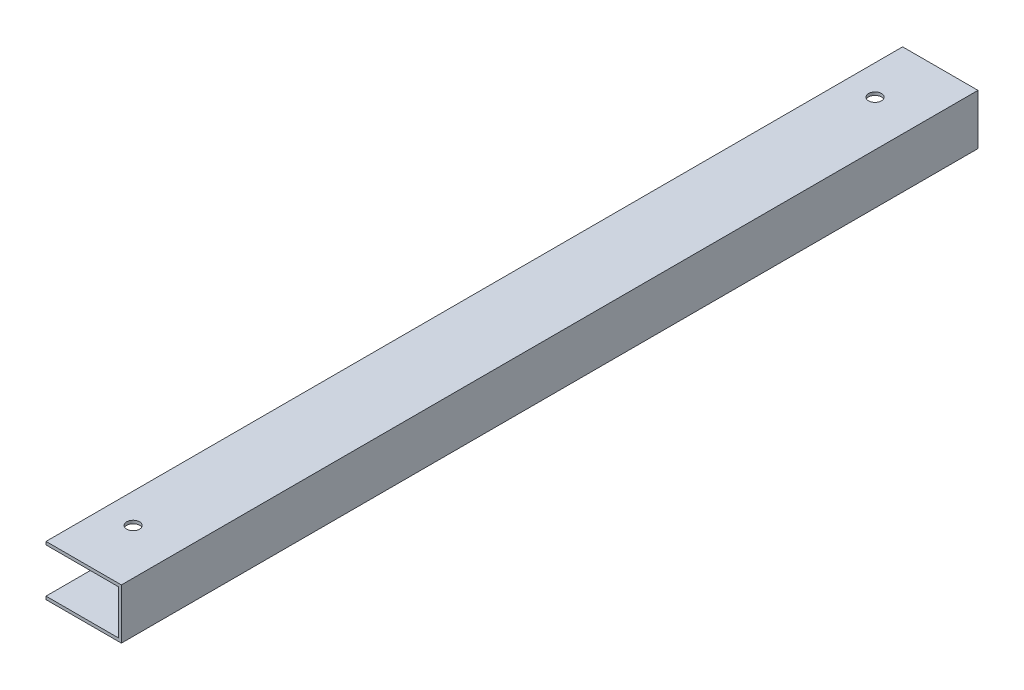
ISO-10303-21;
HEADER;
FILE_DESCRIPTION(('STEP AP214'),'2;1');
FILE_NAME('part.step','',(''),(''),'','','');
FILE_SCHEMA(('AUTOMOTIVE_DESIGN { 1 0 10303 214 1 1 1 1 }'));
ENDSEC;
DATA;
#1=APPLICATION_CONTEXT('core data for automotive mechanical design processes');
#2=APPLICATION_PROTOCOL_DEFINITION('international standard','automotive_design',2000,#1);
#3=PRODUCT_CONTEXT('',#1,'mechanical');
#4=PRODUCT('Part','Part','',(#3));
#5=PRODUCT_RELATED_PRODUCT_CATEGORY('part','',(#4));
#6=PRODUCT_DEFINITION_FORMATION('','',#4);
#7=PRODUCT_DEFINITION_CONTEXT('part definition',#1,'design');
#8=PRODUCT_DEFINITION('design','',#6,#7);
#9=PRODUCT_DEFINITION_SHAPE('','',#8);
#10=(LENGTH_UNIT() NAMED_UNIT(*) SI_UNIT(.MILLI.,.METRE.));
#11=(NAMED_UNIT(*) PLANE_ANGLE_UNIT() SI_UNIT($,.RADIAN.));
#12=(NAMED_UNIT(*) SI_UNIT($,.STERADIAN.) SOLID_ANGLE_UNIT());
#13=UNCERTAINTY_MEASURE_WITH_UNIT(LENGTH_MEASURE(1.E-05),#10,'distance_accuracy_value','');
#14=(GEOMETRIC_REPRESENTATION_CONTEXT(3) GLOBAL_UNCERTAINTY_ASSIGNED_CONTEXT((#13)) GLOBAL_UNIT_ASSIGNED_CONTEXT((#10,
#11,#12)) REPRESENTATION_CONTEXT('',''));
#15=CARTESIAN_POINT('',(0.,0.,0.));
#16=DIRECTION('',(0.,0.,1.));
#17=DIRECTION('',(1.,0.,0.));
#18=AXIS2_PLACEMENT_3D('',#15,#16,#17);
#19=CARTESIAN_POINT('',(-38.1,-25.5,433.));
#20=DIRECTION('',(1.,0.,0.));
#21=DIRECTION('',(0.,1.,0.));
#22=AXIS2_PLACEMENT_3D('',#19,#20,#21);
#23=PLANE('',#22);
#24=DIRECTION('',(0.,-1.,0.));
#25=VECTOR('',#24,1.);
#26=CARTESIAN_POINT('',(-38.1,-25.5,-433.));
#27=LINE('',#26,#25);
#28=CARTESIAN_POINT('',(-38.1,25.5,-433.));
#29=VERTEX_POINT('',#28);
#30=CARTESIAN_POINT('',(-38.1,22.4,-433.));
#31=VERTEX_POINT('',#30);
#32=EDGE_CURVE('E130',#29,#31,#27,.T.);
#33=ORIENTED_EDGE('',*,*,#32,.T.);
#34=DIRECTION('',(0.,0.,-1.));
#35=VECTOR('',#34,1.);
#36=CARTESIAN_POINT('',(-38.1,22.4,433.));
#37=LINE('',#36,#35);
#38=CARTESIAN_POINT('',(-38.1,22.4,433.));
#39=VERTEX_POINT('',#38);
#40=EDGE_CURVE('E123',#39,#31,#37,.T.);
#41=ORIENTED_EDGE('',*,*,#40,.F.);
#42=DIRECTION('',(0.,-1.,0.));
#43=VECTOR('',#42,1.);
#44=CARTESIAN_POINT('',(-38.1,-25.5,433.));
#45=LINE('',#44,#43);
#46=CARTESIAN_POINT('',(-38.1,25.5,433.));
#47=VERTEX_POINT('',#46);
#48=EDGE_CURVE('E183',#47,#39,#45,.T.);
#49=ORIENTED_EDGE('',*,*,#48,.F.);
#50=DIRECTION('',(0.,0.,-1.));
#51=VECTOR('',#50,1.);
#52=CARTESIAN_POINT('',(-38.1,25.5,433.));
#53=LINE('',#52,#51);
#54=EDGE_CURVE('E142',#47,#29,#53,.T.);
#55=ORIENTED_EDGE('',*,*,#54,.T.);
#56=EDGE_LOOP('',(#33,#41,#49,#55));
#57=FACE_BOUND('',#56,.T.);
#58=ADVANCED_FACE('F32',(#57),#23,.F.);
#59=CARTESIAN_POINT('',(-38.1,-22.4,433.));
#60=VERTEX_POINT('',#59);
#61=CARTESIAN_POINT('',(-38.1,-25.5,433.));
#62=VERTEX_POINT('',#61);
#63=EDGE_CURVE('E86',#60,#62,#45,.T.);
#64=ORIENTED_EDGE('',*,*,#63,.F.);
#65=DIRECTION('',(0.,0.,1.));
#66=VECTOR('',#65,1.);
#67=CARTESIAN_POINT('',(-38.1,-22.4,433.));
#68=LINE('',#67,#66);
#69=CARTESIAN_POINT('',(-38.1,-22.4,-433.));
#70=VERTEX_POINT('',#69);
#71=EDGE_CURVE('E112',#70,#60,#68,.T.);
#72=ORIENTED_EDGE('',*,*,#71,.F.);
#73=CARTESIAN_POINT('',(-38.1,-25.5,-433.));
#74=VERTEX_POINT('',#73);
#75=EDGE_CURVE('E121',#70,#74,#27,.T.);
#76=ORIENTED_EDGE('',*,*,#75,.T.);
#77=DIRECTION('',(0.,0.,-1.));
#78=VECTOR('',#77,1.);
#79=CARTESIAN_POINT('',(-38.1,-25.5,433.));
#80=LINE('',#79,#78);
#81=EDGE_CURVE('E149',#62,#74,#80,.T.);
#82=ORIENTED_EDGE('',*,*,#81,.F.);
#83=EDGE_LOOP('',(#64,#72,#76,#82));
#84=FACE_BOUND('',#83,.T.);
#85=ADVANCED_FACE('F34',(#84),#23,.F.);
#86=CARTESIAN_POINT('',(38.1,-25.5,433.));
#87=DIRECTION('',(0.,1.,0.));
#88=DIRECTION('',(-1.,0.,0.));
#89=AXIS2_PLACEMENT_3D('',#86,#87,#88);
#90=PLANE('',#89);
#91=CARTESIAN_POINT('',(-7.99999999999998,-25.5,-375.));
#92=DIRECTION('',(0.,1.,0.));
#93=DIRECTION('',(-1.,0.,0.));
#94=AXIS2_PLACEMENT_3D('',#91,#92,#93);
#95=CIRCLE('',#94,6.50000000000001);
#96=CARTESIAN_POINT('',(-14.5,-25.5,-375.));
#97=VERTEX_POINT('',#96);
#98=EDGE_CURVE('E124',#97,#97,#95,.T.);
#99=ORIENTED_EDGE('',*,*,#98,.T.);
#100=EDGE_LOOP('',(#99));
#101=FACE_BOUND('',#100,.T.);
#102=CARTESIAN_POINT('',(-7.99999999999998,-25.5,375.));
#103=DIRECTION('',(0.,1.,0.));
#104=DIRECTION('',(-1.,0.,0.));
#105=AXIS2_PLACEMENT_3D('',#102,#103,#104);
#106=CIRCLE('',#105,6.50000000000001);
#107=CARTESIAN_POINT('',(-14.5,-25.5,375.));
#108=VERTEX_POINT('',#107);
#109=EDGE_CURVE('E158',#108,#108,#106,.T.);
#110=ORIENTED_EDGE('',*,*,#109,.T.);
#111=EDGE_LOOP('',(#110));
#112=FACE_BOUND('',#111,.T.);
#113=DIRECTION('',(1.,0.,0.));
#114=VECTOR('',#113,1.);
#115=CARTESIAN_POINT('',(38.1,-25.5,-433.));
#116=LINE('',#115,#114);
#117=CARTESIAN_POINT('',(38.1,-25.5,-433.));
#118=VERTEX_POINT('',#117);
#119=EDGE_CURVE('E128',#74,#118,#116,.T.);
#120=ORIENTED_EDGE('',*,*,#119,.T.);
#121=DIRECTION('',(0.,0.,-1.));
#122=VECTOR('',#121,1.);
#123=CARTESIAN_POINT('',(38.1,-25.5,433.));
#124=LINE('',#123,#122);
#125=CARTESIAN_POINT('',(38.1,-25.5,433.));
#126=VERTEX_POINT('',#125);
#127=EDGE_CURVE('E146',#126,#118,#124,.T.);
#128=ORIENTED_EDGE('',*,*,#127,.F.);
#129=DIRECTION('',(1.,0.,0.));
#130=VECTOR('',#129,1.);
#131=CARTESIAN_POINT('',(38.1,-25.5,433.));
#132=LINE('',#131,#130);
#133=EDGE_CURVE('E185',#62,#126,#132,.T.);
#134=ORIENTED_EDGE('',*,*,#133,.F.);
#135=ORIENTED_EDGE('',*,*,#81,.T.);
#136=EDGE_LOOP('',(#120,#128,#134,#135));
#137=FACE_BOUND('',#136,.T.);
#138=ADVANCED_FACE('F219',(#101,#112,#137),#90,.F.);
#139=CARTESIAN_POINT('',(38.1,-25.5,433.));
#140=DIRECTION('',(-1.,0.,0.));
#141=DIRECTION('',(0.,0.,1.));
#142=AXIS2_PLACEMENT_3D('',#139,#140,#141);
#143=PLANE('',#142);
#144=DIRECTION('',(0.,1.,0.));
#145=VECTOR('',#144,1.);
#146=CARTESIAN_POINT('',(38.1,-25.5,-433.));
#147=LINE('',#146,#145);
#148=CARTESIAN_POINT('',(38.1,25.5,-433.));
#149=VERTEX_POINT('',#148);
#150=EDGE_CURVE('E139',#118,#149,#147,.T.);
#151=ORIENTED_EDGE('',*,*,#150,.T.);
#152=DIRECTION('',(0.,0.,-1.));
#153=VECTOR('',#152,1.);
#154=CARTESIAN_POINT('',(38.1,25.5,433.));
#155=LINE('',#154,#153);
#156=CARTESIAN_POINT('',(38.1,25.5,433.));
#157=VERTEX_POINT('',#156);
#158=EDGE_CURVE('E144',#157,#149,#155,.T.);
#159=ORIENTED_EDGE('',*,*,#158,.F.);
#160=DIRECTION('',(0.,1.,0.));
#161=VECTOR('',#160,1.);
#162=CARTESIAN_POINT('',(38.1,-25.5,433.));
#163=LINE('',#162,#161);
#164=EDGE_CURVE('E186',#126,#157,#163,.T.);
#165=ORIENTED_EDGE('',*,*,#164,.F.);
#166=ORIENTED_EDGE('',*,*,#127,.T.);
#167=EDGE_LOOP('',(#151,#159,#165,#166));
#168=FACE_BOUND('',#167,.T.);
#169=ADVANCED_FACE('F192',(#168),#143,.F.);
#170=CARTESIAN_POINT('',(38.1,25.5,433.));
#171=DIRECTION('',(0.,-1.,0.));
#172=DIRECTION('',(1.,0.,0.));
#173=AXIS2_PLACEMENT_3D('',#170,#171,#172);
#174=PLANE('',#173);
#175=CARTESIAN_POINT('',(-7.99999999999999,25.5,-375.));
#176=DIRECTION('',(0.,1.,0.));
#177=DIRECTION('',(-1.,0.,0.));
#178=AXIS2_PLACEMENT_3D('',#175,#176,#177);
#179=CIRCLE('',#178,6.50000000000001);
#180=CARTESIAN_POINT('',(-14.5,25.5,-375.));
#181=VERTEX_POINT('',#180);
#182=EDGE_CURVE('E154',#181,#181,#179,.T.);
#183=ORIENTED_EDGE('',*,*,#182,.F.);
#184=EDGE_LOOP('',(#183));
#185=FACE_BOUND('',#184,.T.);
#186=CARTESIAN_POINT('',(-7.99999999999999,25.5,375.));
#187=DIRECTION('',(0.,1.,0.));
#188=DIRECTION('',(1.,0.,0.));
#189=AXIS2_PLACEMENT_3D('',#186,#187,#188);
#190=CIRCLE('',#189,6.50000000000001);
#191=CARTESIAN_POINT('',(-1.49999999999999,25.5,375.));
#192=VERTEX_POINT('',#191);
#193=EDGE_CURVE('E161',#192,#192,#190,.T.);
#194=ORIENTED_EDGE('',*,*,#193,.F.);
#195=EDGE_LOOP('',(#194));
#196=FACE_BOUND('',#195,.T.);
#197=DIRECTION('',(-1.,0.,0.));
#198=VECTOR('',#197,1.);
#199=CARTESIAN_POINT('',(38.1,25.5,-433.));
#200=LINE('',#199,#198);
#201=EDGE_CURVE('E79',#149,#29,#200,.T.);
#202=ORIENTED_EDGE('',*,*,#201,.T.);
#203=ORIENTED_EDGE('',*,*,#54,.F.);
#204=DIRECTION('',(-1.,0.,0.));
#205=VECTOR('',#204,1.);
#206=CARTESIAN_POINT('',(38.1,25.5,433.));
#207=LINE('',#206,#205);
#208=EDGE_CURVE('E58',#157,#47,#207,.T.);
#209=ORIENTED_EDGE('',*,*,#208,.F.);
#210=ORIENTED_EDGE('',*,*,#158,.T.);
#211=EDGE_LOOP('',(#202,#203,#209,#210));
#212=FACE_BOUND('',#211,.T.);
#213=ADVANCED_FACE('F193',(#185,#196,#212),#174,.F.);
#214=CARTESIAN_POINT('',(0.,0.,433.));
#215=DIRECTION('',(0.,0.,1.));
#216=DIRECTION('',(1.,0.,0.));
#217=AXIS2_PLACEMENT_3D('',#214,#215,#216);
#218=PLANE('',#217);
#219=ORIENTED_EDGE('',*,*,#48,.T.);
#220=DIRECTION('',(-1.,0.,0.));
#221=VECTOR('',#220,1.);
#222=CARTESIAN_POINT('',(0.,22.4,433.));
#223=LINE('',#222,#221);
#224=CARTESIAN_POINT('',(35.,22.4,433.));
#225=VERTEX_POINT('',#224);
#226=EDGE_CURVE('E178',#225,#39,#223,.T.);
#227=ORIENTED_EDGE('',*,*,#226,.F.);
#228=DIRECTION('',(0.,1.,0.));
#229=VECTOR('',#228,1.);
#230=CARTESIAN_POINT('',(35.,0.,433.));
#231=LINE('',#230,#229);
#232=CARTESIAN_POINT('',(35.,-22.4,433.));
#233=VERTEX_POINT('',#232);
#234=EDGE_CURVE('E49',#233,#225,#231,.T.);
#235=ORIENTED_EDGE('',*,*,#234,.F.);
#236=DIRECTION('',(1.,0.,0.));
#237=VECTOR('',#236,1.);
#238=CARTESIAN_POINT('',(0.,-22.4,433.));
#239=LINE('',#238,#237);
#240=EDGE_CURVE('E180',#60,#233,#239,.T.);
#241=ORIENTED_EDGE('',*,*,#240,.F.);
#242=ORIENTED_EDGE('',*,*,#63,.T.);
#243=ORIENTED_EDGE('',*,*,#133,.T.);
#244=ORIENTED_EDGE('',*,*,#164,.T.);
#245=ORIENTED_EDGE('',*,*,#208,.T.);
#246=EDGE_LOOP('',(#219,#227,#235,#241,#242,#243,#244,#245));
#247=FACE_BOUND('',#246,.T.);
#248=ADVANCED_FACE('F189',(#247),#218,.T.);
#249=CARTESIAN_POINT('',(0.,0.,-433.));
#250=DIRECTION('',(0.,0.,1.));
#251=DIRECTION('',(1.,0.,0.));
#252=AXIS2_PLACEMENT_3D('',#249,#250,#251);
#253=PLANE('',#252);
#254=DIRECTION('',(-1.,0.,0.));
#255=VECTOR('',#254,1.);
#256=CARTESIAN_POINT('',(0.,22.4,-433.));
#257=LINE('',#256,#255);
#258=CARTESIAN_POINT('',(35.,22.4,-433.));
#259=VERTEX_POINT('',#258);
#260=EDGE_CURVE('E117',#259,#31,#257,.T.);
#261=ORIENTED_EDGE('',*,*,#260,.T.);
#262=ORIENTED_EDGE('',*,*,#32,.F.);
#263=ORIENTED_EDGE('',*,*,#201,.F.);
#264=ORIENTED_EDGE('',*,*,#150,.F.);
#265=ORIENTED_EDGE('',*,*,#119,.F.);
#266=ORIENTED_EDGE('',*,*,#75,.F.);
#267=DIRECTION('',(1.,0.,0.));
#268=VECTOR('',#267,1.);
#269=CARTESIAN_POINT('',(0.,-22.4,-433.));
#270=LINE('',#269,#268);
#271=CARTESIAN_POINT('',(35.,-22.4,-433.));
#272=VERTEX_POINT('',#271);
#273=EDGE_CURVE('E41',#70,#272,#270,.T.);
#274=ORIENTED_EDGE('',*,*,#273,.T.);
#275=DIRECTION('',(0.,1.,0.));
#276=VECTOR('',#275,1.);
#277=CARTESIAN_POINT('',(35.,0.,-433.));
#278=LINE('',#277,#276);
#279=EDGE_CURVE('E11',#272,#259,#278,.T.);
#280=ORIENTED_EDGE('',*,*,#279,.T.);
#281=EDGE_LOOP('',(#261,#262,#263,#264,#265,#266,#274,#280));
#282=FACE_BOUND('',#281,.T.);
#283=ADVANCED_FACE('F126',(#282),#253,.F.);
#284=CARTESIAN_POINT('',(35.,0.,-467.));
#285=DIRECTION('',(1.,0.,0.));
#286=DIRECTION('',(0.,0.,-1.));
#287=AXIS2_PLACEMENT_3D('',#284,#285,#286);
#288=PLANE('',#287);
#289=DIRECTION('',(0.,0.,1.));
#290=VECTOR('',#289,1.);
#291=CARTESIAN_POINT('',(35.,-22.4,-467.));
#292=LINE('',#291,#290);
#293=EDGE_CURVE('E113',#272,#233,#292,.T.);
#294=ORIENTED_EDGE('',*,*,#293,.T.);
#295=ORIENTED_EDGE('',*,*,#234,.T.);
#296=DIRECTION('',(0.,0.,1.));
#297=VECTOR('',#296,1.);
#298=CARTESIAN_POINT('',(35.,22.4,-467.));
#299=LINE('',#298,#297);
#300=EDGE_CURVE('E133',#259,#225,#299,.T.);
#301=ORIENTED_EDGE('',*,*,#300,.F.);
#302=ORIENTED_EDGE('',*,*,#279,.F.);
#303=EDGE_LOOP('',(#294,#295,#301,#302));
#304=FACE_BOUND('',#303,.T.);
#305=ADVANCED_FACE('F201',(#304),#288,.F.);
#306=CARTESIAN_POINT('',(0.,-22.4,-467.));
#307=DIRECTION('',(0.,-1.,0.));
#308=DIRECTION('',(1.,0.,0.));
#309=AXIS2_PLACEMENT_3D('',#306,#307,#308);
#310=PLANE('',#309);
#311=CARTESIAN_POINT('',(-7.99999999999998,-22.4,-375.));
#312=DIRECTION('',(0.,-1.,0.));
#313=DIRECTION('',(1.,0.,0.));
#314=AXIS2_PLACEMENT_3D('',#311,#312,#313);
#315=CIRCLE('',#314,6.50000000000001);
#316=CARTESIAN_POINT('',(-1.49999999999997,-22.4,-375.));
#317=VERTEX_POINT('',#316);
#318=EDGE_CURVE('E170',#317,#317,#315,.T.);
#319=ORIENTED_EDGE('',*,*,#318,.T.);
#320=EDGE_LOOP('',(#319));
#321=FACE_BOUND('',#320,.T.);
#322=CARTESIAN_POINT('',(-7.99999999999998,-22.4,375.));
#323=DIRECTION('',(0.,-1.,0.));
#324=DIRECTION('',(1.,0.,0.));
#325=AXIS2_PLACEMENT_3D('',#322,#323,#324);
#326=CIRCLE('',#325,6.50000000000001);
#327=CARTESIAN_POINT('',(-1.49999999999997,-22.4,375.));
#328=VERTEX_POINT('',#327);
#329=EDGE_CURVE('E153',#328,#328,#326,.T.);
#330=ORIENTED_EDGE('',*,*,#329,.T.);
#331=EDGE_LOOP('',(#330));
#332=FACE_BOUND('',#331,.T.);
#333=ORIENTED_EDGE('',*,*,#240,.T.);
#334=ORIENTED_EDGE('',*,*,#293,.F.);
#335=ORIENTED_EDGE('',*,*,#273,.F.);
#336=ORIENTED_EDGE('',*,*,#71,.T.);
#337=EDGE_LOOP('',(#333,#334,#335,#336));
#338=FACE_BOUND('',#337,.T.);
#339=ADVANCED_FACE('F111',(#321,#332,#338),#310,.F.);
#340=CARTESIAN_POINT('',(0.,22.4,-467.));
#341=DIRECTION('',(0.,1.,0.));
#342=DIRECTION('',(-1.,0.,0.));
#343=AXIS2_PLACEMENT_3D('',#340,#341,#342);
#344=PLANE('',#343);
#345=CARTESIAN_POINT('',(-7.99999999999999,22.4,-375.));
#346=DIRECTION('',(0.,1.,0.));
#347=DIRECTION('',(-1.,0.,0.));
#348=AXIS2_PLACEMENT_3D('',#345,#346,#347);
#349=CIRCLE('',#348,6.50000000000001);
#350=CARTESIAN_POINT('',(-14.5,22.4,-375.));
#351=VERTEX_POINT('',#350);
#352=EDGE_CURVE('E36',#351,#351,#349,.T.);
#353=ORIENTED_EDGE('',*,*,#352,.T.);
#354=EDGE_LOOP('',(#353));
#355=FACE_BOUND('',#354,.T.);
#356=CARTESIAN_POINT('',(-7.99999999999999,22.4,375.));
#357=DIRECTION('',(0.,1.,0.));
#358=DIRECTION('',(-1.,0.,0.));
#359=AXIS2_PLACEMENT_3D('',#356,#357,#358);
#360=CIRCLE('',#359,6.50000000000001);
#361=CARTESIAN_POINT('',(-14.5,22.4,375.));
#362=VERTEX_POINT('',#361);
#363=EDGE_CURVE('E151',#362,#362,#360,.T.);
#364=ORIENTED_EDGE('',*,*,#363,.T.);
#365=EDGE_LOOP('',(#364));
#366=FACE_BOUND('',#365,.T.);
#367=ORIENTED_EDGE('',*,*,#40,.T.);
#368=ORIENTED_EDGE('',*,*,#260,.F.);
#369=ORIENTED_EDGE('',*,*,#300,.T.);
#370=ORIENTED_EDGE('',*,*,#226,.T.);
#371=EDGE_LOOP('',(#367,#368,#369,#370));
#372=FACE_BOUND('',#371,.T.);
#373=ADVANCED_FACE('F200',(#355,#366,#372),#344,.F.);
#374=CARTESIAN_POINT('',(-7.99999999999997,-54.5,375.));
#375=DIRECTION('',(0.,1.,0.));
#376=DIRECTION('',(-1.,0.,0.));
#377=AXIS2_PLACEMENT_3D('',#374,#375,#376);
#378=CYLINDRICAL_SURFACE('',#377,6.50000000000001);
#379=ORIENTED_EDGE('',*,*,#193,.T.);
#380=EDGE_LOOP('',(#379));
#381=FACE_BOUND('',#380,.T.);
#382=ORIENTED_EDGE('',*,*,#363,.F.);
#383=EDGE_LOOP('',(#382));
#384=FACE_BOUND('',#383,.T.);
#385=ADVANCED_FACE('F263',(#381,#384),#378,.F.);
#386=CARTESIAN_POINT('',(-7.99999999999997,-54.5,-375.));
#387=DIRECTION('',(0.,1.,0.));
#388=DIRECTION('',(-1.,0.,0.));
#389=AXIS2_PLACEMENT_3D('',#386,#387,#388);
#390=CYLINDRICAL_SURFACE('',#389,6.50000000000001);
#391=ORIENTED_EDGE('',*,*,#182,.T.);
#392=EDGE_LOOP('',(#391));
#393=FACE_BOUND('',#392,.T.);
#394=ORIENTED_EDGE('',*,*,#352,.F.);
#395=EDGE_LOOP('',(#394));
#396=FACE_BOUND('',#395,.T.);
#397=ADVANCED_FACE('F280',(#393,#396),#390,.F.);
#398=ORIENTED_EDGE('',*,*,#329,.F.);
#399=EDGE_LOOP('',(#398));
#400=FACE_BOUND('',#399,.T.);
#401=ORIENTED_EDGE('',*,*,#109,.F.);
#402=EDGE_LOOP('',(#401));
#403=FACE_BOUND('',#402,.T.);
#404=ADVANCED_FACE('F283',(#400,#403),#378,.F.);
#405=ORIENTED_EDGE('',*,*,#318,.F.);
#406=EDGE_LOOP('',(#405));
#407=FACE_BOUND('',#406,.T.);
#408=ORIENTED_EDGE('',*,*,#98,.F.);
#409=EDGE_LOOP('',(#408));
#410=FACE_BOUND('',#409,.T.);
#411=ADVANCED_FACE('F289',(#407,#410),#390,.F.);
#412=CLOSED_SHELL('',(#58,#85,#138,#169,#213,#248,#283,#305,#339,#373,#385,#397,#404,#411));
#413=MANIFOLD_SOLID_BREP('B2',#412);
#414=ADVANCED_BREP_SHAPE_REPRESENTATION('',(#18,#413),#14);
#415=SHAPE_DEFINITION_REPRESENTATION(#9,#414);
ENDSEC;
END-ISO-10303-21;
